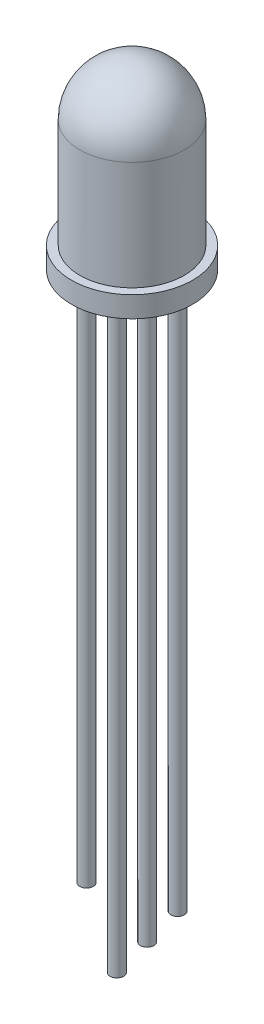
ISO-10303-21;
HEADER;
FILE_DESCRIPTION(('STEP AP214'),'2;1');
FILE_NAME('part.step','',(''),(''),'','','');
FILE_SCHEMA(('AUTOMOTIVE_DESIGN { 1 0 10303 214 1 1 1 1 }'));
ENDSEC;
DATA;
#1=APPLICATION_CONTEXT('core data for automotive mechanical design processes');
#2=APPLICATION_PROTOCOL_DEFINITION('international standard','automotive_design',2000,#1);
#3=PRODUCT_CONTEXT('',#1,'mechanical');
#4=PRODUCT('Part','Part','',(#3));
#5=PRODUCT_RELATED_PRODUCT_CATEGORY('part','',(#4));
#6=PRODUCT_DEFINITION_FORMATION('','',#4);
#7=PRODUCT_DEFINITION_CONTEXT('part definition',#1,'design');
#8=PRODUCT_DEFINITION('design','',#6,#7);
#9=PRODUCT_DEFINITION_SHAPE('','',#8);
#10=(LENGTH_UNIT() NAMED_UNIT(*) SI_UNIT(.MILLI.,.METRE.));
#11=(NAMED_UNIT(*) PLANE_ANGLE_UNIT() SI_UNIT($,.RADIAN.));
#12=(NAMED_UNIT(*) SI_UNIT($,.STERADIAN.) SOLID_ANGLE_UNIT());
#13=UNCERTAINTY_MEASURE_WITH_UNIT(LENGTH_MEASURE(1.E-05),#10,'distance_accuracy_value','');
#14=(GEOMETRIC_REPRESENTATION_CONTEXT(3) GLOBAL_UNCERTAINTY_ASSIGNED_CONTEXT((#13)) GLOBAL_UNIT_ASSIGNED_CONTEXT((#10,
#11,#12)) REPRESENTATION_CONTEXT('',''));
#15=CARTESIAN_POINT('',(0.,0.,0.));
#16=DIRECTION('',(0.,0.,1.));
#17=DIRECTION('',(1.,0.,0.));
#18=AXIS2_PLACEMENT_3D('',#15,#16,#17);
#19=CARTESIAN_POINT('',(0.,0.,-2.9));
#20=DIRECTION('',(0.,-1.,0.));
#21=DIRECTION('',(0.,0.,-1.));
#22=AXIS2_PLACEMENT_3D('',#19,#20,#21);
#23=PLANE('',#22);
#24=CARTESIAN_POINT('',(-2.1781,0.,0.));
#25=DIRECTION('',(0.,-1.,0.));
#26=DIRECTION('',(0.,0.,-1.));
#27=AXIS2_PLACEMENT_3D('',#24,#25,#26);
#28=CIRCLE('',#27,0.321900000000001);
#29=CARTESIAN_POINT('',(-2.1781,0.,-0.321900000000001));
#30=VERTEX_POINT('',#29);
#31=EDGE_CURVE('E11',#30,#30,#28,.T.);
#32=ORIENTED_EDGE('',*,*,#31,.F.);
#33=EDGE_LOOP('',(#32));
#34=FACE_BOUND('',#33,.T.);
#35=ADVANCED_FACE('F48',(#34),#23,.F.);
#36=CARTESIAN_POINT('',(-2.1781,-26.5,0.));
#37=DIRECTION('',(0.,-1.,0.));
#38=DIRECTION('',(0.,0.,-1.));
#39=AXIS2_PLACEMENT_3D('',#36,#37,#38);
#40=PLANE('',#39);
#41=CARTESIAN_POINT('',(-2.1781,-26.5,0.));
#42=DIRECTION('',(0.,-1.,0.));
#43=DIRECTION('',(0.,0.,-1.));
#44=AXIS2_PLACEMENT_3D('',#41,#42,#43);
#45=CIRCLE('',#44,0.321900000000001);
#46=CARTESIAN_POINT('',(-2.1781,-26.5,-0.321900000000001));
#47=VERTEX_POINT('',#46);
#48=EDGE_CURVE('E51',#47,#47,#45,.T.);
#49=ORIENTED_EDGE('',*,*,#48,.T.);
#50=EDGE_LOOP('',(#49));
#51=FACE_BOUND('',#50,.T.);
#52=ADVANCED_FACE('F60',(#51),#40,.T.);
#53=CARTESIAN_POINT('',(-2.1781,-26.5,0.));
#54=DIRECTION('',(0.,1.,0.));
#55=DIRECTION('',(0.,0.,1.));
#56=AXIS2_PLACEMENT_3D('',#53,#54,#55);
#57=CYLINDRICAL_SURFACE('',#56,0.321900000000001);
#58=ORIENTED_EDGE('',*,*,#48,.F.);
#59=EDGE_LOOP('',(#58));
#60=FACE_BOUND('',#59,.T.);
#61=ORIENTED_EDGE('',*,*,#31,.T.);
#62=EDGE_LOOP('',(#61));
#63=FACE_BOUND('',#62,.T.);
#64=ADVANCED_FACE('F62',(#60,#63),#57,.T.);
#65=CLOSED_SHELL('',(#35,#52,#64));
#66=MANIFOLD_SOLID_BREP('B2',#65);
#67=CARTESIAN_POINT('',(0.,0.,-2.9));
#68=DIRECTION('',(0.,-1.,0.));
#69=DIRECTION('',(0.,0.,-1.));
#70=AXIS2_PLACEMENT_3D('',#67,#68,#69);
#71=PLANE('',#70);
#72=CARTESIAN_POINT('',(-0.726033333333333,0.,0.));
#73=DIRECTION('',(0.,-1.,0.));
#74=DIRECTION('',(0.,0.,-1.));
#75=AXIS2_PLACEMENT_3D('',#72,#73,#74);
#76=CIRCLE('',#75,0.3219);
#77=CARTESIAN_POINT('',(-0.726033333333333,0.,-0.3219));
#78=VERTEX_POINT('',#77);
#79=EDGE_CURVE('E47',#78,#78,#76,.T.);
#80=ORIENTED_EDGE('',*,*,#79,.F.);
#81=EDGE_LOOP('',(#80));
#82=FACE_BOUND('',#81,.T.);
#83=ADVANCED_FACE('F97',(#82),#71,.F.);
#84=CARTESIAN_POINT('',(-0.726033333333333,-29.5,0.));
#85=DIRECTION('',(0.,-1.,0.));
#86=DIRECTION('',(0.,0.,-1.));
#87=AXIS2_PLACEMENT_3D('',#84,#85,#86);
#88=PLANE('',#87);
#89=CARTESIAN_POINT('',(-0.726033333333333,-29.5,0.));
#90=DIRECTION('',(0.,-1.,0.));
#91=DIRECTION('',(0.,0.,-1.));
#92=AXIS2_PLACEMENT_3D('',#89,#90,#91);
#93=CIRCLE('',#92,0.3219);
#94=CARTESIAN_POINT('',(-0.726033333333333,-29.5,-0.3219));
#95=VERTEX_POINT('',#94);
#96=EDGE_CURVE('E100',#95,#95,#93,.T.);
#97=ORIENTED_EDGE('',*,*,#96,.T.);
#98=EDGE_LOOP('',(#97));
#99=FACE_BOUND('',#98,.T.);
#100=ADVANCED_FACE('F109',(#99),#88,.T.);
#101=CARTESIAN_POINT('',(-0.726033333333333,-29.5,0.));
#102=DIRECTION('',(0.,1.,0.));
#103=DIRECTION('',(0.,0.,1.));
#104=AXIS2_PLACEMENT_3D('',#101,#102,#103);
#105=CYLINDRICAL_SURFACE('',#104,0.3219);
#106=ORIENTED_EDGE('',*,*,#96,.F.);
#107=EDGE_LOOP('',(#106));
#108=FACE_BOUND('',#107,.T.);
#109=ORIENTED_EDGE('',*,*,#79,.T.);
#110=EDGE_LOOP('',(#109));
#111=FACE_BOUND('',#110,.T.);
#112=ADVANCED_FACE('F111',(#108,#111),#105,.T.);
#113=CLOSED_SHELL('',(#83,#100,#112));
#114=MANIFOLD_SOLID_BREP('B6',#113);
#115=CARTESIAN_POINT('',(0.,0.,-2.9));
#116=DIRECTION('',(0.,-1.,0.));
#117=DIRECTION('',(0.,0.,-1.));
#118=AXIS2_PLACEMENT_3D('',#115,#116,#117);
#119=PLANE('',#118);
#120=CARTESIAN_POINT('',(0.726033333333334,0.,0.));
#121=DIRECTION('',(0.,-1.,0.));
#122=DIRECTION('',(0.,0.,-1.));
#123=AXIS2_PLACEMENT_3D('',#120,#121,#122);
#124=CIRCLE('',#123,0.3219);
#125=CARTESIAN_POINT('',(0.726033333333334,0.,-0.3219));
#126=VERTEX_POINT('',#125);
#127=EDGE_CURVE('E96',#126,#126,#124,.T.);
#128=ORIENTED_EDGE('',*,*,#127,.F.);
#129=EDGE_LOOP('',(#128));
#130=FACE_BOUND('',#129,.T.);
#131=ADVANCED_FACE('F146',(#130),#119,.F.);
#132=CARTESIAN_POINT('',(0.726033333333334,-27.5,0.));
#133=DIRECTION('',(0.,-1.,0.));
#134=DIRECTION('',(0.,0.,-1.));
#135=AXIS2_PLACEMENT_3D('',#132,#133,#134);
#136=PLANE('',#135);
#137=CARTESIAN_POINT('',(0.726033333333334,-27.5,0.));
#138=DIRECTION('',(0.,-1.,0.));
#139=DIRECTION('',(0.,0.,-1.));
#140=AXIS2_PLACEMENT_3D('',#137,#138,#139);
#141=CIRCLE('',#140,0.3219);
#142=CARTESIAN_POINT('',(0.726033333333334,-27.5,-0.3219));
#143=VERTEX_POINT('',#142);
#144=EDGE_CURVE('E149',#143,#143,#141,.T.);
#145=ORIENTED_EDGE('',*,*,#144,.T.);
#146=EDGE_LOOP('',(#145));
#147=FACE_BOUND('',#146,.T.);
#148=ADVANCED_FACE('F158',(#147),#136,.T.);
#149=CARTESIAN_POINT('',(0.726033333333334,-27.5,0.));
#150=DIRECTION('',(0.,1.,0.));
#151=DIRECTION('',(0.,0.,1.));
#152=AXIS2_PLACEMENT_3D('',#149,#150,#151);
#153=CYLINDRICAL_SURFACE('',#152,0.3219);
#154=ORIENTED_EDGE('',*,*,#144,.F.);
#155=EDGE_LOOP('',(#154));
#156=FACE_BOUND('',#155,.T.);
#157=ORIENTED_EDGE('',*,*,#127,.T.);
#158=EDGE_LOOP('',(#157));
#159=FACE_BOUND('',#158,.T.);
#160=ADVANCED_FACE('F160',(#156,#159),#153,.T.);
#161=CLOSED_SHELL('',(#131,#148,#160));
#162=MANIFOLD_SOLID_BREP('B42',#161);
#163=CARTESIAN_POINT('',(0.,0.,-2.9));
#164=DIRECTION('',(0.,-1.,0.));
#165=DIRECTION('',(0.,0.,-1.));
#166=AXIS2_PLACEMENT_3D('',#163,#164,#165);
#167=PLANE('',#166);
#168=CARTESIAN_POINT('',(2.1781,0.,0.));
#169=DIRECTION('',(0.,-1.,0.));
#170=DIRECTION('',(0.,0.,-1.));
#171=AXIS2_PLACEMENT_3D('',#168,#169,#170);
#172=CIRCLE('',#171,0.3219);
#173=CARTESIAN_POINT('',(2.1781,0.,-0.321900000000001));
#174=VERTEX_POINT('',#173);
#175=EDGE_CURVE('E198',#174,#174,#172,.T.);
#176=ORIENTED_EDGE('',*,*,#175,.F.);
#177=EDGE_LOOP('',(#176));
#178=FACE_BOUND('',#177,.T.);
#179=ADVANCED_FACE('F195',(#178),#167,.F.);
#180=CARTESIAN_POINT('',(2.1781,-25.5,0.));
#181=DIRECTION('',(0.,-1.,0.));
#182=DIRECTION('',(0.,0.,-1.));
#183=AXIS2_PLACEMENT_3D('',#180,#181,#182);
#184=PLANE('',#183);
#185=CARTESIAN_POINT('',(2.1781,-25.5,0.));
#186=DIRECTION('',(0.,-1.,0.));
#187=DIRECTION('',(0.,0.,-1.));
#188=AXIS2_PLACEMENT_3D('',#185,#186,#187);
#189=CIRCLE('',#188,0.3219);
#190=CARTESIAN_POINT('',(2.1781,-25.5,-0.321900000000001));
#191=VERTEX_POINT('',#190);
#192=EDGE_CURVE('E145',#191,#191,#189,.T.);
#193=ORIENTED_EDGE('',*,*,#192,.T.);
#194=EDGE_LOOP('',(#193));
#195=FACE_BOUND('',#194,.T.);
#196=ADVANCED_FACE('F210',(#195),#184,.T.);
#197=CARTESIAN_POINT('',(2.1781,-25.5,0.));
#198=DIRECTION('',(0.,1.,0.));
#199=DIRECTION('',(0.,0.,1.));
#200=AXIS2_PLACEMENT_3D('',#197,#198,#199);
#201=CYLINDRICAL_SURFACE('',#200,0.3219);
#202=ORIENTED_EDGE('',*,*,#192,.F.);
#203=EDGE_LOOP('',(#202));
#204=FACE_BOUND('',#203,.T.);
#205=ORIENTED_EDGE('',*,*,#175,.T.);
#206=EDGE_LOOP('',(#205));
#207=FACE_BOUND('',#206,.T.);
#208=ADVANCED_FACE('F207',(#204,#207),#201,.T.);
#209=CLOSED_SHELL('',(#179,#196,#208));
#210=MANIFOLD_SOLID_BREP('B91',#209);
#211=CARTESIAN_POINT('',(0.,0.,-2.9));
#212=DIRECTION('',(0.,-1.,0.));
#213=DIRECTION('',(0.,0.,-1.));
#214=AXIS2_PLACEMENT_3D('',#211,#212,#213);
#215=PLANE('',#214);
#216=CARTESIAN_POINT('',(0.,0.,0.));
#217=DIRECTION('',(0.,-1.,0.));
#218=DIRECTION('',(0.,0.,-1.));
#219=AXIS2_PLACEMENT_3D('',#216,#217,#218);
#220=CIRCLE('',#219,2.9);
#221=CARTESIAN_POINT('',(0.,0.,-2.9));
#222=VERTEX_POINT('',#221);
#223=EDGE_CURVE('E250',#222,#222,#220,.T.);
#224=ORIENTED_EDGE('',*,*,#223,.T.);
#225=EDGE_LOOP('',(#224));
#226=FACE_BOUND('',#225,.T.);
#227=ADVANCED_FACE('F243',(#226),#215,.T.);
#228=CARTESIAN_POINT('',(0.,1.,-2.9));
#229=DIRECTION('',(0.,1.,0.));
#230=DIRECTION('',(0.,0.,1.));
#231=AXIS2_PLACEMENT_3D('',#228,#229,#230);
#232=PLANE('',#231);
#233=CARTESIAN_POINT('',(0.,1.,0.));
#234=DIRECTION('',(0.,-1.,0.));
#235=DIRECTION('',(0.,0.,-1.));
#236=AXIS2_PLACEMENT_3D('',#233,#234,#235);
#237=CIRCLE('',#236,2.9);
#238=CARTESIAN_POINT('',(0.,1.,-2.9));
#239=VERTEX_POINT('',#238);
#240=EDGE_CURVE('E194',#239,#239,#237,.T.);
#241=ORIENTED_EDGE('',*,*,#240,.F.);
#242=EDGE_LOOP('',(#241));
#243=FACE_BOUND('',#242,.T.);
#244=ADVANCED_FACE('F245',(#243),#232,.T.);
#245=CARTESIAN_POINT('',(0.,0.,0.));
#246=DIRECTION('',(0.,-1.,0.));
#247=DIRECTION('',(0.,0.,-1.));
#248=AXIS2_PLACEMENT_3D('',#245,#246,#247);
#249=CYLINDRICAL_SURFACE('',#248,2.9);
#250=ORIENTED_EDGE('',*,*,#240,.T.);
#251=EDGE_LOOP('',(#250));
#252=FACE_BOUND('',#251,.T.);
#253=ORIENTED_EDGE('',*,*,#223,.F.);
#254=EDGE_LOOP('',(#253));
#255=FACE_BOUND('',#254,.T.);
#256=ADVANCED_FACE('F257',(#252,#255),#249,.T.);
#257=CLOSED_SHELL('',(#227,#244,#256));
#258=MANIFOLD_SOLID_BREP('B140',#257);
#259=CARTESIAN_POINT('',(0.,1.,-2.9));
#260=DIRECTION('',(0.,1.,0.));
#261=DIRECTION('',(0.,0.,1.));
#262=AXIS2_PLACEMENT_3D('',#259,#260,#261);
#263=PLANE('',#262);
#264=CARTESIAN_POINT('',(0.,1.,0.));
#265=DIRECTION('',(0.,-1.,0.));
#266=DIRECTION('',(0.,0.,-1.));
#267=AXIS2_PLACEMENT_3D('',#264,#265,#266);
#268=CIRCLE('',#267,2.5);
#269=CARTESIAN_POINT('',(0.,1.,-2.5));
#270=VERTEX_POINT('',#269);
#271=EDGE_CURVE('E303',#270,#270,#268,.T.);
#272=ORIENTED_EDGE('',*,*,#271,.T.);
#273=EDGE_LOOP('',(#272));
#274=FACE_BOUND('',#273,.T.);
#275=ADVANCED_FACE('F299',(#274),#263,.F.);
#276=CARTESIAN_POINT('',(0.,6.2,0.));
#277=DIRECTION('',(0.,-1.,0.));
#278=DIRECTION('',(1.,0.,0.));
#279=AXIS2_PLACEMENT_3D('',#276,#277,#278);
#280=SPHERICAL_SURFACE('',#279,2.5);
#281=CARTESIAN_POINT('',(0.,6.2,0.));
#282=DIRECTION('',(0.,-1.,0.));
#283=DIRECTION('',(0.,0.,-1.));
#284=AXIS2_PLACEMENT_3D('',#281,#282,#283);
#285=CIRCLE('',#284,2.5);
#286=CARTESIAN_POINT('',(0.,6.2,-2.5));
#287=VERTEX_POINT('',#286);
#288=EDGE_CURVE('E242',#287,#287,#285,.T.);
#289=ORIENTED_EDGE('',*,*,#288,.F.);
#290=EDGE_LOOP('',(#289));
#291=FACE_BOUND('',#290,.T.);
#292=ADVANCED_FACE('F301',(#291),#280,.T.);
#293=CARTESIAN_POINT('',(0.,0.,0.));
#294=DIRECTION('',(0.,-1.,0.));
#295=DIRECTION('',(0.,0.,-1.));
#296=AXIS2_PLACEMENT_3D('',#293,#294,#295);
#297=CYLINDRICAL_SURFACE('',#296,2.5);
#298=ORIENTED_EDGE('',*,*,#288,.T.);
#299=EDGE_LOOP('',(#298));
#300=FACE_BOUND('',#299,.T.);
#301=ORIENTED_EDGE('',*,*,#271,.F.);
#302=EDGE_LOOP('',(#301));
#303=FACE_BOUND('',#302,.T.);
#304=ADVANCED_FACE('F315',(#300,#303),#297,.T.);
#305=CLOSED_SHELL('',(#275,#292,#304));
#306=MANIFOLD_SOLID_BREP('B189',#305);
#307=ADVANCED_BREP_SHAPE_REPRESENTATION('',(#18,#66,#114,#162,#210,#258,#306),#14);
#308=SHAPE_DEFINITION_REPRESENTATION(#9,#307);
ENDSEC;
END-ISO-10303-21;
